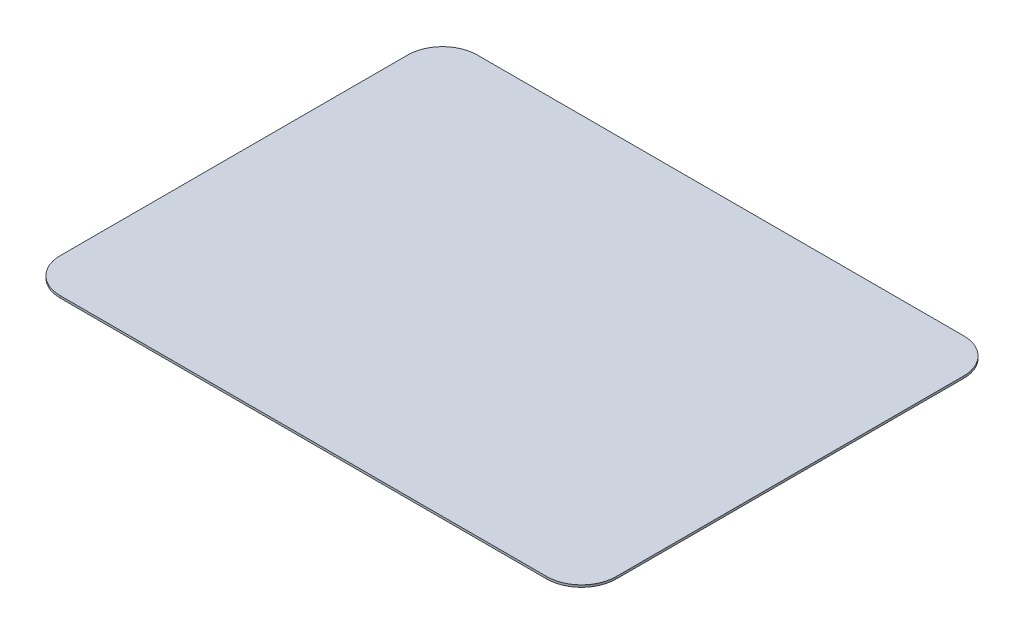
ISO-10303-21;
HEADER;
FILE_DESCRIPTION(('STEP AP214'),'2;1');
FILE_NAME('part.step','',(''),(''),'','','');
FILE_SCHEMA(('AUTOMOTIVE_DESIGN { 1 0 10303 214 1 1 1 1 }'));
ENDSEC;
DATA;
#1=APPLICATION_CONTEXT('core data for automotive mechanical design processes');
#2=APPLICATION_PROTOCOL_DEFINITION('international standard','automotive_design',2000,#1);
#3=PRODUCT_CONTEXT('',#1,'mechanical');
#4=PRODUCT('Part','Part','',(#3));
#5=PRODUCT_RELATED_PRODUCT_CATEGORY('part','',(#4));
#6=PRODUCT_DEFINITION_FORMATION('','',#4);
#7=PRODUCT_DEFINITION_CONTEXT('part definition',#1,'design');
#8=PRODUCT_DEFINITION('design','',#6,#7);
#9=PRODUCT_DEFINITION_SHAPE('','',#8);
#10=(LENGTH_UNIT() NAMED_UNIT(*) SI_UNIT(.MILLI.,.METRE.));
#11=(NAMED_UNIT(*) PLANE_ANGLE_UNIT() SI_UNIT($,.RADIAN.));
#12=(NAMED_UNIT(*) SI_UNIT($,.STERADIAN.) SOLID_ANGLE_UNIT());
#13=UNCERTAINTY_MEASURE_WITH_UNIT(LENGTH_MEASURE(1.E-05),#10,'distance_accuracy_value','');
#14=(GEOMETRIC_REPRESENTATION_CONTEXT(3) GLOBAL_UNCERTAINTY_ASSIGNED_CONTEXT((#13)) GLOBAL_UNIT_ASSIGNED_CONTEXT((#10,
#11,#12)) REPRESENTATION_CONTEXT('',''));
#15=CARTESIAN_POINT('',(0.,0.,0.));
#16=DIRECTION('',(0.,0.,1.));
#17=DIRECTION('',(1.,0.,0.));
#18=AXIS2_PLACEMENT_3D('',#15,#16,#17);
#19=CARTESIAN_POINT('',(88.8999999999999,7.14375,63.4999999999999));
#20=DIRECTION('',(0.,-1.,0.));
#21=DIRECTION('',(0.,0.,-1.));
#22=AXIS2_PLACEMENT_3D('',#19,#20,#21);
#23=CYLINDRICAL_SURFACE('',#22,12.7000000000001);
#24=CARTESIAN_POINT('',(88.8999999999999,6.35,63.4999999999999));
#25=DIRECTION('',(0.,1.,0.));
#26=DIRECTION('',(0.,0.,1.));
#27=AXIS2_PLACEMENT_3D('',#24,#25,#26);
#28=CIRCLE('',#27,12.7000000000001);
#29=CARTESIAN_POINT('',(88.8999999999999,6.35,76.2));
#30=VERTEX_POINT('',#29);
#31=CARTESIAN_POINT('',(101.6,6.35,63.4999999999999));
#32=VERTEX_POINT('',#31);
#33=EDGE_CURVE('E129',#30,#32,#28,.T.);
#34=ORIENTED_EDGE('',*,*,#33,.T.);
#35=DIRECTION('',(0.,-1.,0.));
#36=VECTOR('',#35,1.);
#37=CARTESIAN_POINT('',(101.6,7.14375,63.4999999999999));
#38=LINE('',#37,#36);
#39=CARTESIAN_POINT('',(101.6,7.14375,63.4999999999999));
#40=VERTEX_POINT('',#39);
#41=EDGE_CURVE('E11',#40,#32,#38,.T.);
#42=ORIENTED_EDGE('',*,*,#41,.F.);
#43=CARTESIAN_POINT('',(88.8999999999999,7.14375,63.4999999999999));
#44=DIRECTION('',(0.,1.,0.));
#45=DIRECTION('',(0.,0.,1.));
#46=AXIS2_PLACEMENT_3D('',#43,#44,#45);
#47=CIRCLE('',#46,12.7000000000001);
#48=CARTESIAN_POINT('',(88.8999999999999,7.14375,76.2));
#49=VERTEX_POINT('',#48);
#50=EDGE_CURVE('E143',#49,#40,#47,.T.);
#51=ORIENTED_EDGE('',*,*,#50,.F.);
#52=DIRECTION('',(0.,-1.,0.));
#53=VECTOR('',#52,1.);
#54=CARTESIAN_POINT('',(88.8999999999999,7.14375,76.2));
#55=LINE('',#54,#53);
#56=EDGE_CURVE('E125',#49,#30,#55,.T.);
#57=ORIENTED_EDGE('',*,*,#56,.T.);
#58=EDGE_LOOP('',(#34,#42,#51,#57));
#59=FACE_BOUND('',#58,.T.);
#60=ADVANCED_FACE('F33',(#59),#23,.T.);
#61=CARTESIAN_POINT('',(101.6,7.14375,63.4999999999999));
#62=DIRECTION('',(-1.,0.,0.));
#63=DIRECTION('',(0.,0.,1.));
#64=AXIS2_PLACEMENT_3D('',#61,#62,#63);
#65=PLANE('',#64);
#66=DIRECTION('',(0.,0.,-1.));
#67=VECTOR('',#66,1.);
#68=CARTESIAN_POINT('',(101.6,6.35,63.4999999999999));
#69=LINE('',#68,#67);
#70=CARTESIAN_POINT('',(101.6,6.35,-63.4999999999999));
#71=VERTEX_POINT('',#70);
#72=EDGE_CURVE('E132',#32,#71,#69,.T.);
#73=ORIENTED_EDGE('',*,*,#72,.T.);
#74=DIRECTION('',(0.,-1.,0.));
#75=VECTOR('',#74,1.);
#76=CARTESIAN_POINT('',(101.6,7.14375,-63.4999999999999));
#77=LINE('',#76,#75);
#78=CARTESIAN_POINT('',(101.6,7.14375,-63.4999999999999));
#79=VERTEX_POINT('',#78);
#80=EDGE_CURVE('E41',#79,#71,#77,.T.);
#81=ORIENTED_EDGE('',*,*,#80,.F.);
#82=DIRECTION('',(0.,0.,-1.));
#83=VECTOR('',#82,1.);
#84=CARTESIAN_POINT('',(101.6,7.14375,63.4999999999999));
#85=LINE('',#84,#83);
#86=EDGE_CURVE('E92',#40,#79,#85,.T.);
#87=ORIENTED_EDGE('',*,*,#86,.F.);
#88=ORIENTED_EDGE('',*,*,#41,.T.);
#89=EDGE_LOOP('',(#73,#81,#87,#88));
#90=FACE_BOUND('',#89,.T.);
#91=ADVANCED_FACE('F178',(#90),#65,.F.);
#92=CARTESIAN_POINT('',(88.9,7.14375,-63.5));
#93=DIRECTION('',(0.,-1.,0.));
#94=DIRECTION('',(0.,0.,-1.));
#95=AXIS2_PLACEMENT_3D('',#92,#93,#94);
#96=CYLINDRICAL_SURFACE('',#95,12.7000000000001);
#97=CARTESIAN_POINT('',(88.9,6.35,-63.5));
#98=DIRECTION('',(0.,1.,0.));
#99=DIRECTION('',(0.,0.,1.));
#100=AXIS2_PLACEMENT_3D('',#97,#98,#99);
#101=CIRCLE('',#100,12.7000000000001);
#102=CARTESIAN_POINT('',(88.9,6.35,-76.2000000000001));
#103=VERTEX_POINT('',#102);
#104=EDGE_CURVE('E134',#71,#103,#101,.T.);
#105=ORIENTED_EDGE('',*,*,#104,.T.);
#106=DIRECTION('',(0.,-1.,0.));
#107=VECTOR('',#106,1.);
#108=CARTESIAN_POINT('',(88.9,7.14375,-76.2000000000001));
#109=LINE('',#108,#107);
#110=CARTESIAN_POINT('',(88.9,7.14375,-76.2000000000001));
#111=VERTEX_POINT('',#110);
#112=EDGE_CURVE('E150',#111,#103,#109,.T.);
#113=ORIENTED_EDGE('',*,*,#112,.F.);
#114=CARTESIAN_POINT('',(88.9,7.14375,-63.5));
#115=DIRECTION('',(0.,1.,0.));
#116=DIRECTION('',(0.,0.,1.));
#117=AXIS2_PLACEMENT_3D('',#114,#115,#116);
#118=CIRCLE('',#117,12.7000000000001);
#119=EDGE_CURVE('E158',#79,#111,#118,.T.);
#120=ORIENTED_EDGE('',*,*,#119,.F.);
#121=ORIENTED_EDGE('',*,*,#80,.T.);
#122=EDGE_LOOP('',(#105,#113,#120,#121));
#123=FACE_BOUND('',#122,.T.);
#124=ADVANCED_FACE('F156',(#123),#96,.T.);
#125=CARTESIAN_POINT('',(88.9,7.14375,-76.2000000000001));
#126=DIRECTION('',(0.,0.,1.));
#127=DIRECTION('',(1.,0.,0.));
#128=AXIS2_PLACEMENT_3D('',#125,#126,#127);
#129=PLANE('',#128);
#130=DIRECTION('',(-1.,0.,0.));
#131=VECTOR('',#130,1.);
#132=CARTESIAN_POINT('',(88.9,6.35,-76.2000000000001));
#133=LINE('',#132,#131);
#134=CARTESIAN_POINT('',(-88.9000000000002,6.35,-76.2));
#135=VERTEX_POINT('',#134);
#136=EDGE_CURVE('E136',#103,#135,#133,.T.);
#137=ORIENTED_EDGE('',*,*,#136,.T.);
#138=DIRECTION('',(0.,-1.,0.));
#139=VECTOR('',#138,1.);
#140=CARTESIAN_POINT('',(-88.9000000000002,7.14375,-76.2));
#141=LINE('',#140,#139);
#142=CARTESIAN_POINT('',(-88.9000000000002,7.14375,-76.2));
#143=VERTEX_POINT('',#142);
#144=EDGE_CURVE('E147',#143,#135,#141,.T.);
#145=ORIENTED_EDGE('',*,*,#144,.F.);
#146=DIRECTION('',(-1.,0.,0.));
#147=VECTOR('',#146,1.);
#148=CARTESIAN_POINT('',(88.9,7.14375,-76.2000000000001));
#149=LINE('',#148,#147);
#150=EDGE_CURVE('E170',#111,#143,#149,.T.);
#151=ORIENTED_EDGE('',*,*,#150,.F.);
#152=ORIENTED_EDGE('',*,*,#112,.T.);
#153=EDGE_LOOP('',(#137,#145,#151,#152));
#154=FACE_BOUND('',#153,.T.);
#155=ADVANCED_FACE('F166',(#154),#129,.F.);
#156=CARTESIAN_POINT('',(-88.9000000000002,7.14375,-63.5));
#157=DIRECTION('',(0.,-1.,0.));
#158=DIRECTION('',(0.,0.,-1.));
#159=AXIS2_PLACEMENT_3D('',#156,#157,#158);
#160=CYLINDRICAL_SURFACE('',#159,12.7000000000001);
#161=CARTESIAN_POINT('',(-88.9000000000002,6.35,-63.5));
#162=DIRECTION('',(0.,1.,0.));
#163=DIRECTION('',(0.,0.,1.));
#164=AXIS2_PLACEMENT_3D('',#161,#162,#163);
#165=CIRCLE('',#164,12.7000000000001);
#166=CARTESIAN_POINT('',(-101.6,6.35,-63.5));
#167=VERTEX_POINT('',#166);
#168=EDGE_CURVE('E138',#135,#167,#165,.T.);
#169=ORIENTED_EDGE('',*,*,#168,.T.);
#170=DIRECTION('',(0.,-1.,0.));
#171=VECTOR('',#170,1.);
#172=CARTESIAN_POINT('',(-101.6,7.14375,-63.5));
#173=LINE('',#172,#171);
#174=CARTESIAN_POINT('',(-101.6,7.14375,-63.5));
#175=VERTEX_POINT('',#174);
#176=EDGE_CURVE('E120',#175,#167,#173,.T.);
#177=ORIENTED_EDGE('',*,*,#176,.F.);
#178=CARTESIAN_POINT('',(-88.9000000000002,7.14375,-63.5));
#179=DIRECTION('',(0.,1.,0.));
#180=DIRECTION('',(0.,0.,1.));
#181=AXIS2_PLACEMENT_3D('',#178,#179,#180);
#182=CIRCLE('',#181,12.7000000000001);
#183=EDGE_CURVE('E111',#143,#175,#182,.T.);
#184=ORIENTED_EDGE('',*,*,#183,.F.);
#185=ORIENTED_EDGE('',*,*,#144,.T.);
#186=EDGE_LOOP('',(#169,#177,#184,#185));
#187=FACE_BOUND('',#186,.T.);
#188=ADVANCED_FACE('F169',(#187),#160,.T.);
#189=CARTESIAN_POINT('',(-101.6,7.14375,-63.5));
#190=DIRECTION('',(1.,0.,0.));
#191=DIRECTION('',(0.,0.,-1.));
#192=AXIS2_PLACEMENT_3D('',#189,#190,#191);
#193=PLANE('',#192);
#194=DIRECTION('',(0.,0.,1.));
#195=VECTOR('',#194,1.);
#196=CARTESIAN_POINT('',(-101.6,6.35,-63.5));
#197=LINE('',#196,#195);
#198=CARTESIAN_POINT('',(-101.6,6.35,63.4999999999999));
#199=VERTEX_POINT('',#198);
#200=EDGE_CURVE('E119',#167,#199,#197,.T.);
#201=ORIENTED_EDGE('',*,*,#200,.T.);
#202=DIRECTION('',(0.,-1.,0.));
#203=VECTOR('',#202,1.);
#204=CARTESIAN_POINT('',(-101.6,7.14375,63.4999999999999));
#205=LINE('',#204,#203);
#206=CARTESIAN_POINT('',(-101.6,7.14375,63.4999999999999));
#207=VERTEX_POINT('',#206);
#208=EDGE_CURVE('E116',#207,#199,#205,.T.);
#209=ORIENTED_EDGE('',*,*,#208,.F.);
#210=DIRECTION('',(0.,0.,1.));
#211=VECTOR('',#210,1.);
#212=CARTESIAN_POINT('',(-101.6,7.14375,-63.5));
#213=LINE('',#212,#211);
#214=EDGE_CURVE('E105',#175,#207,#213,.T.);
#215=ORIENTED_EDGE('',*,*,#214,.F.);
#216=ORIENTED_EDGE('',*,*,#176,.T.);
#217=EDGE_LOOP('',(#201,#209,#215,#216));
#218=FACE_BOUND('',#217,.T.);
#219=ADVANCED_FACE('F117',(#218),#193,.F.);
#220=CARTESIAN_POINT('',(-88.9000000000002,7.14375,63.4999999999998));
#221=DIRECTION('',(0.,-1.,0.));
#222=DIRECTION('',(0.,0.,-1.));
#223=AXIS2_PLACEMENT_3D('',#220,#221,#222);
#224=CYLINDRICAL_SURFACE('',#223,12.7000000000001);
#225=CARTESIAN_POINT('',(-88.9000000000002,6.35,63.4999999999998));
#226=DIRECTION('',(0.,1.,0.));
#227=DIRECTION('',(0.,0.,1.));
#228=AXIS2_PLACEMENT_3D('',#225,#226,#227);
#229=CIRCLE('',#228,12.7000000000001);
#230=CARTESIAN_POINT('',(-88.9000000000002,6.35,76.1999999999999));
#231=VERTEX_POINT('',#230);
#232=EDGE_CURVE('E78',#199,#231,#229,.T.);
#233=ORIENTED_EDGE('',*,*,#232,.T.);
#234=DIRECTION('',(0.,-1.,0.));
#235=VECTOR('',#234,1.);
#236=CARTESIAN_POINT('',(-88.9000000000002,7.14375,76.1999999999999));
#237=LINE('',#236,#235);
#238=CARTESIAN_POINT('',(-88.9000000000002,7.14375,76.1999999999999));
#239=VERTEX_POINT('',#238);
#240=EDGE_CURVE('E121',#239,#231,#237,.T.);
#241=ORIENTED_EDGE('',*,*,#240,.F.);
#242=CARTESIAN_POINT('',(-88.9000000000002,7.14375,63.4999999999998));
#243=DIRECTION('',(0.,1.,0.));
#244=DIRECTION('',(0.,0.,1.));
#245=AXIS2_PLACEMENT_3D('',#242,#243,#244);
#246=CIRCLE('',#245,12.7000000000001);
#247=EDGE_CURVE('E109',#207,#239,#246,.T.);
#248=ORIENTED_EDGE('',*,*,#247,.F.);
#249=ORIENTED_EDGE('',*,*,#208,.T.);
#250=EDGE_LOOP('',(#233,#241,#248,#249));
#251=FACE_BOUND('',#250,.T.);
#252=ADVANCED_FACE('F123',(#251),#224,.T.);
#253=CARTESIAN_POINT('',(-88.9000000000002,7.14375,76.1999999999999));
#254=DIRECTION('',(0.,0.,-1.));
#255=DIRECTION('',(-1.,0.,0.));
#256=AXIS2_PLACEMENT_3D('',#253,#254,#255);
#257=PLANE('',#256);
#258=DIRECTION('',(1.,0.,0.));
#259=VECTOR('',#258,1.);
#260=CARTESIAN_POINT('',(-88.9000000000002,6.35,76.1999999999999));
#261=LINE('',#260,#259);
#262=EDGE_CURVE('E84',#231,#30,#261,.T.);
#263=ORIENTED_EDGE('',*,*,#262,.T.);
#264=ORIENTED_EDGE('',*,*,#56,.F.);
#265=DIRECTION('',(1.,0.,0.));
#266=VECTOR('',#265,1.);
#267=CARTESIAN_POINT('',(-88.9000000000002,7.14375,76.1999999999999));
#268=LINE('',#267,#266);
#269=EDGE_CURVE('E49',#239,#49,#268,.T.);
#270=ORIENTED_EDGE('',*,*,#269,.F.);
#271=ORIENTED_EDGE('',*,*,#240,.T.);
#272=EDGE_LOOP('',(#263,#264,#270,#271));
#273=FACE_BOUND('',#272,.T.);
#274=ADVANCED_FACE('F194',(#273),#257,.F.);
#275=CARTESIAN_POINT('',(88.8999999999999,7.14375,63.4999999999999));
#276=DIRECTION('',(0.,1.,0.));
#277=DIRECTION('',(0.,0.,1.));
#278=AXIS2_PLACEMENT_3D('',#275,#276,#277);
#279=PLANE('',#278);
#280=ORIENTED_EDGE('',*,*,#50,.T.);
#281=ORIENTED_EDGE('',*,*,#86,.T.);
#282=ORIENTED_EDGE('',*,*,#119,.T.);
#283=ORIENTED_EDGE('',*,*,#150,.T.);
#284=ORIENTED_EDGE('',*,*,#183,.T.);
#285=ORIENTED_EDGE('',*,*,#214,.T.);
#286=ORIENTED_EDGE('',*,*,#247,.T.);
#287=ORIENTED_EDGE('',*,*,#269,.T.);
#288=EDGE_LOOP('',(#280,#281,#282,#283,#284,#285,#286,#287));
#289=FACE_BOUND('',#288,.T.);
#290=ADVANCED_FACE('F107',(#289),#279,.T.);
#291=CARTESIAN_POINT('',(88.8999999999999,6.35,63.4999999999999));
#292=DIRECTION('',(0.,1.,0.));
#293=DIRECTION('',(0.,0.,1.));
#294=AXIS2_PLACEMENT_3D('',#291,#292,#293);
#295=PLANE('',#294);
#296=ORIENTED_EDGE('',*,*,#33,.F.);
#297=ORIENTED_EDGE('',*,*,#262,.F.);
#298=ORIENTED_EDGE('',*,*,#232,.F.);
#299=ORIENTED_EDGE('',*,*,#200,.F.);
#300=ORIENTED_EDGE('',*,*,#168,.F.);
#301=ORIENTED_EDGE('',*,*,#136,.F.);
#302=ORIENTED_EDGE('',*,*,#104,.F.);
#303=ORIENTED_EDGE('',*,*,#72,.F.);
#304=EDGE_LOOP('',(#296,#297,#298,#299,#300,#301,#302,#303));
#305=FACE_BOUND('',#304,.T.);
#306=ADVANCED_FACE('F162',(#305),#295,.F.);
#307=CLOSED_SHELL('',(#60,#91,#124,#155,#188,#219,#252,#274,#290,#306));
#308=MANIFOLD_SOLID_BREP('B2',#307);
#309=ADVANCED_BREP_SHAPE_REPRESENTATION('',(#18,#308),#14);
#310=SHAPE_DEFINITION_REPRESENTATION(#9,#309);
ENDSEC;
END-ISO-10303-21;
